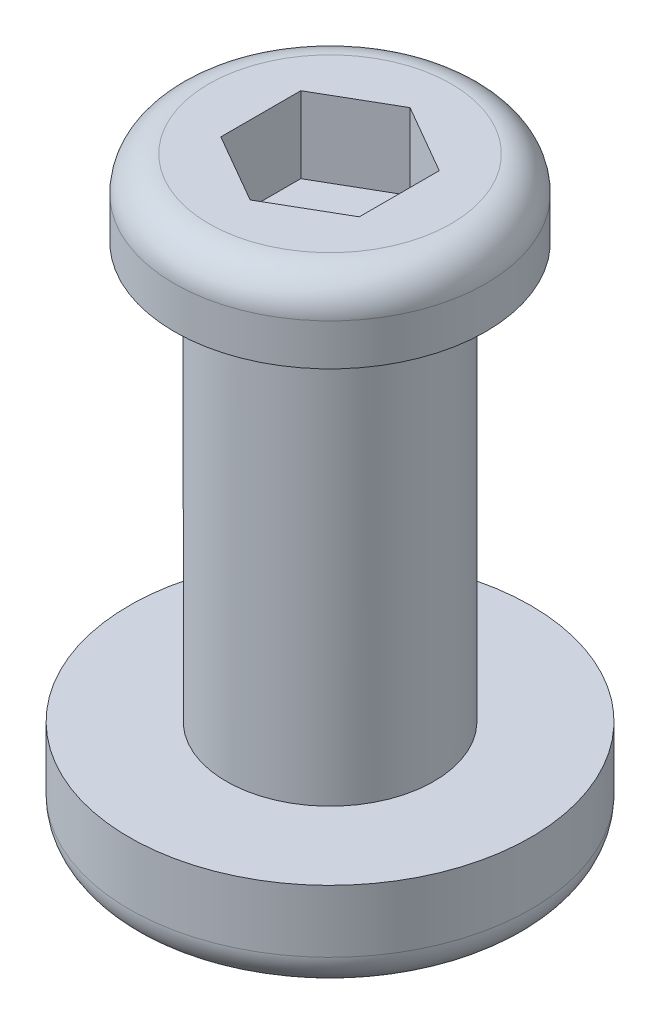
ISO-10303-21;
HEADER;
FILE_DESCRIPTION(('STEP AP214'),'2;1');
FILE_NAME('part.step','',(''),(''),'','','');
FILE_SCHEMA(('AUTOMOTIVE_DESIGN { 1 0 10303 214 1 1 1 1 }'));
ENDSEC;
DATA;
#1=APPLICATION_CONTEXT('core data for automotive mechanical design processes');
#2=APPLICATION_PROTOCOL_DEFINITION('international standard','automotive_design',2000,#1);
#3=PRODUCT_CONTEXT('',#1,'mechanical');
#4=PRODUCT('Part','Part','',(#3));
#5=PRODUCT_RELATED_PRODUCT_CATEGORY('part','',(#4));
#6=PRODUCT_DEFINITION_FORMATION('','',#4);
#7=PRODUCT_DEFINITION_CONTEXT('part definition',#1,'design');
#8=PRODUCT_DEFINITION('design','',#6,#7);
#9=PRODUCT_DEFINITION_SHAPE('','',#8);
#10=(LENGTH_UNIT() NAMED_UNIT(*) SI_UNIT(.MILLI.,.METRE.));
#11=(NAMED_UNIT(*) PLANE_ANGLE_UNIT() SI_UNIT($,.RADIAN.));
#12=(NAMED_UNIT(*) SI_UNIT($,.STERADIAN.) SOLID_ANGLE_UNIT());
#13=UNCERTAINTY_MEASURE_WITH_UNIT(LENGTH_MEASURE(1.E-05),#10,'distance_accuracy_value','');
#14=(GEOMETRIC_REPRESENTATION_CONTEXT(3) GLOBAL_UNCERTAINTY_ASSIGNED_CONTEXT((#13)) GLOBAL_UNIT_ASSIGNED_CONTEXT((#10,
#11,#12)) REPRESENTATION_CONTEXT('',''));
#15=CARTESIAN_POINT('',(0.,0.,0.));
#16=DIRECTION('',(0.,0.,1.));
#17=DIRECTION('',(1.,0.,0.));
#18=AXIS2_PLACEMENT_3D('',#15,#16,#17);
#19=CARTESIAN_POINT('',(0.,6.,0.));
#20=DIRECTION('',(0.,-1.,0.));
#21=DIRECTION('',(0.,0.,-1.));
#22=AXIS2_PLACEMENT_3D('',#19,#20,#21);
#23=CYLINDRICAL_SURFACE('',#22,1.5);
#24=CARTESIAN_POINT('',(0.,6.,0.));
#25=DIRECTION('',(0.,1.,0.));
#26=DIRECTION('',(0.,0.,1.));
#27=AXIS2_PLACEMENT_3D('',#24,#25,#26);
#28=CIRCLE('',#27,1.5);
#29=CARTESIAN_POINT('',(0.,6.,1.5));
#30=VERTEX_POINT('',#29);
#31=EDGE_CURVE('E278',#30,#30,#28,.T.);
#32=ORIENTED_EDGE('',*,*,#31,.F.);
#33=EDGE_LOOP('',(#32));
#34=FACE_BOUND('',#33,.T.);
#35=CARTESIAN_POINT('',(0.,0.,0.));
#36=DIRECTION('',(0.,-1.,0.));
#37=DIRECTION('',(0.,0.,-1.));
#38=AXIS2_PLACEMENT_3D('',#35,#36,#37);
#39=CIRCLE('',#38,1.5);
#40=CARTESIAN_POINT('',(0.,0.,-1.5));
#41=VERTEX_POINT('',#40);
#42=EDGE_CURVE('E210',#41,#41,#39,.T.);
#43=ORIENTED_EDGE('',*,*,#42,.F.);
#44=EDGE_LOOP('',(#43));
#45=FACE_BOUND('',#44,.T.);
#46=ADVANCED_FACE('F43',(#34,#45),#23,.T.);
#47=CARTESIAN_POINT('',(0.,7.1,0.));
#48=DIRECTION('',(0.,1.,0.));
#49=DIRECTION('',(0.,0.,1.));
#50=AXIS2_PLACEMENT_3D('',#47,#48,#49);
#51=PLANE('',#50);
#52=CARTESIAN_POINT('',(0.,7.1,0.));
#53=DIRECTION('',(0.,1.,0.));
#54=DIRECTION('',(0.,0.,1.));
#55=AXIS2_PLACEMENT_3D('',#52,#53,#54);
#56=CIRCLE('',#55,1.75);
#57=CARTESIAN_POINT('',(0.,7.1,1.75));
#58=VERTEX_POINT('',#57);
#59=EDGE_CURVE('E282',#58,#58,#56,.T.);
#60=ORIENTED_EDGE('',*,*,#59,.T.);
#61=EDGE_LOOP('',(#60));
#62=FACE_BOUND('',#61,.T.);
#63=DIRECTION('',(-0.866025403784438,0.,0.5));
#64=VECTOR('',#63,1.);
#65=CARTESIAN_POINT('',(0.,7.1,-1.15470053837925));
#66=LINE('',#65,#64);
#67=CARTESIAN_POINT('',(0.,7.1,-1.15470053837925));
#68=VERTEX_POINT('',#67);
#69=CARTESIAN_POINT('',(-1.,7.1,-0.577350269189626));
#70=VERTEX_POINT('',#69);
#71=EDGE_CURVE('E217',#68,#70,#66,.T.);
#72=ORIENTED_EDGE('',*,*,#71,.F.);
#73=DIRECTION('',(-0.866025403784439,0.,-0.5));
#74=VECTOR('',#73,1.);
#75=CARTESIAN_POINT('',(1.,7.1,-0.577350269189626));
#76=LINE('',#75,#74);
#77=CARTESIAN_POINT('',(1.,7.1,-0.577350269189626));
#78=VERTEX_POINT('',#77);
#79=EDGE_CURVE('E214',#78,#68,#76,.T.);
#80=ORIENTED_EDGE('',*,*,#79,.F.);
#81=DIRECTION('',(0.,0.,-1.));
#82=VECTOR('',#81,1.);
#83=CARTESIAN_POINT('',(1.,7.1,0.577350269189626));
#84=LINE('',#83,#82);
#85=CARTESIAN_POINT('',(1.,7.1,0.577350269189626));
#86=VERTEX_POINT('',#85);
#87=EDGE_CURVE('E231',#86,#78,#84,.T.);
#88=ORIENTED_EDGE('',*,*,#87,.F.);
#89=DIRECTION('',(0.866025403784439,0.,-0.5));
#90=VECTOR('',#89,1.);
#91=CARTESIAN_POINT('',(0.,7.1,1.15470053837925));
#92=LINE('',#91,#90);
#93=CARTESIAN_POINT('',(0.,7.1,1.15470053837925));
#94=VERTEX_POINT('',#93);
#95=EDGE_CURVE('E227',#94,#86,#92,.T.);
#96=ORIENTED_EDGE('',*,*,#95,.F.);
#97=DIRECTION('',(0.866025403784439,0.,0.5));
#98=VECTOR('',#97,1.);
#99=CARTESIAN_POINT('',(-1.,7.1,0.577350269189626));
#100=LINE('',#99,#98);
#101=CARTESIAN_POINT('',(-1.,7.1,0.577350269189626));
#102=VERTEX_POINT('',#101);
#103=EDGE_CURVE('E224',#102,#94,#100,.T.);
#104=ORIENTED_EDGE('',*,*,#103,.F.);
#105=DIRECTION('',(0.,0.,1.));
#106=VECTOR('',#105,1.);
#107=CARTESIAN_POINT('',(-1.,7.1,-0.577350269189626));
#108=LINE('',#107,#106);
#109=EDGE_CURVE('E221',#70,#102,#108,.T.);
#110=ORIENTED_EDGE('',*,*,#109,.F.);
#111=EDGE_LOOP('',(#72,#80,#88,#96,#104,#110));
#112=FACE_BOUND('',#111,.T.);
#113=ADVANCED_FACE('F304',(#62,#112),#51,.T.);
#114=CARTESIAN_POINT('',(0.,6.,0.));
#115=DIRECTION('',(0.,1.,0.));
#116=DIRECTION('',(0.,0.,1.));
#117=AXIS2_PLACEMENT_3D('',#114,#115,#116);
#118=PLANE('',#117);
#119=ORIENTED_EDGE('',*,*,#31,.T.);
#120=EDGE_LOOP('',(#119));
#121=FACE_BOUND('',#120,.T.);
#122=CARTESIAN_POINT('',(0.,6.,0.));
#123=DIRECTION('',(0.,1.,0.));
#124=DIRECTION('',(0.,0.,1.));
#125=AXIS2_PLACEMENT_3D('',#122,#123,#124);
#126=CIRCLE('',#125,2.25);
#127=CARTESIAN_POINT('',(0.,6.,2.25));
#128=VERTEX_POINT('',#127);
#129=EDGE_CURVE('E274',#128,#128,#126,.T.);
#130=ORIENTED_EDGE('',*,*,#129,.F.);
#131=EDGE_LOOP('',(#130));
#132=FACE_BOUND('',#131,.T.);
#133=ADVANCED_FACE('F310',(#121,#132),#118,.F.);
#134=CARTESIAN_POINT('',(0.,7.1,0.));
#135=DIRECTION('',(0.,-1.,0.));
#136=DIRECTION('',(0.,0.,-1.));
#137=AXIS2_PLACEMENT_3D('',#134,#135,#136);
#138=CYLINDRICAL_SURFACE('',#137,2.25);
#139=CARTESIAN_POINT('',(0.,6.6,0.));
#140=DIRECTION('',(0.,1.,0.));
#141=DIRECTION('',(0.,0.,1.));
#142=AXIS2_PLACEMENT_3D('',#139,#140,#141);
#143=CIRCLE('',#142,2.25);
#144=CARTESIAN_POINT('',(0.,6.6,2.25));
#145=VERTEX_POINT('',#144);
#146=EDGE_CURVE('E286',#145,#145,#143,.F.);
#147=ORIENTED_EDGE('',*,*,#146,.T.);
#148=EDGE_LOOP('',(#147));
#149=FACE_BOUND('',#148,.T.);
#150=ORIENTED_EDGE('',*,*,#129,.T.);
#151=EDGE_LOOP('',(#150));
#152=FACE_BOUND('',#151,.T.);
#153=ADVANCED_FACE('F324',(#149,#152),#138,.T.);
#154=CARTESIAN_POINT('',(1.,7.1,-0.577350269189626));
#155=DIRECTION('',(-0.5,0.,0.866025403784438));
#156=DIRECTION('',(0.866025403784439,0.,0.5));
#157=AXIS2_PLACEMENT_3D('',#154,#155,#156);
#158=PLANE('',#157);
#159=DIRECTION('',(-0.866025403784439,0.,-0.5));
#160=VECTOR('',#159,1.);
#161=CARTESIAN_POINT('',(1.,6.,-0.577350269189626));
#162=LINE('',#161,#160);
#163=CARTESIAN_POINT('',(1.,6.,-0.577350269189626));
#164=VERTEX_POINT('',#163);
#165=CARTESIAN_POINT('',(0.,6.,-1.15470053837925));
#166=VERTEX_POINT('',#165);
#167=EDGE_CURVE('E67',#164,#166,#162,.T.);
#168=ORIENTED_EDGE('',*,*,#167,.F.);
#169=DIRECTION('',(0.,-1.,0.));
#170=VECTOR('',#169,1.);
#171=CARTESIAN_POINT('',(1.,7.1,-0.577350269189626));
#172=LINE('',#171,#170);
#173=EDGE_CURVE('E234',#78,#164,#172,.T.);
#174=ORIENTED_EDGE('',*,*,#173,.F.);
#175=ORIENTED_EDGE('',*,*,#79,.T.);
#176=DIRECTION('',(0.,-1.,0.));
#177=VECTOR('',#176,1.);
#178=CARTESIAN_POINT('',(0.,7.1,-1.15470053837925));
#179=LINE('',#178,#177);
#180=EDGE_CURVE('E270',#68,#166,#179,.T.);
#181=ORIENTED_EDGE('',*,*,#180,.T.);
#182=EDGE_LOOP('',(#168,#174,#175,#181));
#183=FACE_BOUND('',#182,.T.);
#184=ADVANCED_FACE('F327',(#183),#158,.T.);
#185=CARTESIAN_POINT('',(0.,7.1,-1.15470053837925));
#186=DIRECTION('',(0.5,0.,0.866025403784439));
#187=DIRECTION('',(0.866025403784438,0.,-0.5));
#188=AXIS2_PLACEMENT_3D('',#185,#186,#187);
#189=PLANE('',#188);
#190=DIRECTION('',(-0.866025403784438,0.,0.5));
#191=VECTOR('',#190,1.);
#192=CARTESIAN_POINT('',(0.,6.,-1.15470053837925));
#193=LINE('',#192,#191);
#194=CARTESIAN_POINT('',(-1.,6.,-0.577350269189626));
#195=VERTEX_POINT('',#194);
#196=EDGE_CURVE('E237',#166,#195,#193,.T.);
#197=ORIENTED_EDGE('',*,*,#196,.F.);
#198=ORIENTED_EDGE('',*,*,#180,.F.);
#199=ORIENTED_EDGE('',*,*,#71,.T.);
#200=DIRECTION('',(0.,-1.,0.));
#201=VECTOR('',#200,1.);
#202=CARTESIAN_POINT('',(-1.,7.1,-0.577350269189626));
#203=LINE('',#202,#201);
#204=EDGE_CURVE('E266',#70,#195,#203,.T.);
#205=ORIENTED_EDGE('',*,*,#204,.T.);
#206=EDGE_LOOP('',(#197,#198,#199,#205));
#207=FACE_BOUND('',#206,.T.);
#208=ADVANCED_FACE('F334',(#207),#189,.T.);
#209=CARTESIAN_POINT('',(-1.,7.1,-0.577350269189626));
#210=DIRECTION('',(1.,0.,0.));
#211=DIRECTION('',(0.,0.,-1.));
#212=AXIS2_PLACEMENT_3D('',#209,#210,#211);
#213=PLANE('',#212);
#214=DIRECTION('',(0.,0.,1.));
#215=VECTOR('',#214,1.);
#216=CARTESIAN_POINT('',(-1.,6.,-0.577350269189626));
#217=LINE('',#216,#215);
#218=CARTESIAN_POINT('',(-1.,6.,0.577350269189626));
#219=VERTEX_POINT('',#218);
#220=EDGE_CURVE('E240',#195,#219,#217,.T.);
#221=ORIENTED_EDGE('',*,*,#220,.F.);
#222=ORIENTED_EDGE('',*,*,#204,.F.);
#223=ORIENTED_EDGE('',*,*,#109,.T.);
#224=DIRECTION('',(0.,-1.,0.));
#225=VECTOR('',#224,1.);
#226=CARTESIAN_POINT('',(-1.,7.1,0.577350269189626));
#227=LINE('',#226,#225);
#228=EDGE_CURVE('E262',#102,#219,#227,.T.);
#229=ORIENTED_EDGE('',*,*,#228,.T.);
#230=EDGE_LOOP('',(#221,#222,#223,#229));
#231=FACE_BOUND('',#230,.T.);
#232=ADVANCED_FACE('F338',(#231),#213,.T.);
#233=CARTESIAN_POINT('',(-1.,7.1,0.577350269189626));
#234=DIRECTION('',(0.5,0.,-0.866025403784438));
#235=DIRECTION('',(-0.866025403784439,0.,-0.5));
#236=AXIS2_PLACEMENT_3D('',#233,#234,#235);
#237=PLANE('',#236);
#238=DIRECTION('',(0.866025403784439,0.,0.5));
#239=VECTOR('',#238,1.);
#240=CARTESIAN_POINT('',(-1.,6.,0.577350269189626));
#241=LINE('',#240,#239);
#242=CARTESIAN_POINT('',(0.,6.,1.15470053837925));
#243=VERTEX_POINT('',#242);
#244=EDGE_CURVE('E243',#219,#243,#241,.T.);
#245=ORIENTED_EDGE('',*,*,#244,.F.);
#246=ORIENTED_EDGE('',*,*,#228,.F.);
#247=ORIENTED_EDGE('',*,*,#103,.T.);
#248=DIRECTION('',(0.,-1.,0.));
#249=VECTOR('',#248,1.);
#250=CARTESIAN_POINT('',(0.,7.1,1.15470053837925));
#251=LINE('',#250,#249);
#252=EDGE_CURVE('E258',#94,#243,#251,.T.);
#253=ORIENTED_EDGE('',*,*,#252,.T.);
#254=EDGE_LOOP('',(#245,#246,#247,#253));
#255=FACE_BOUND('',#254,.T.);
#256=ADVANCED_FACE('F342',(#255),#237,.T.);
#257=CARTESIAN_POINT('',(0.,7.1,1.15470053837925));
#258=DIRECTION('',(-0.5,0.,-0.866025403784439));
#259=DIRECTION('',(-0.866025403784439,0.,0.5));
#260=AXIS2_PLACEMENT_3D('',#257,#258,#259);
#261=PLANE('',#260);
#262=DIRECTION('',(0.866025403784439,0.,-0.5));
#263=VECTOR('',#262,1.);
#264=CARTESIAN_POINT('',(0.,6.,1.15470053837925));
#265=LINE('',#264,#263);
#266=CARTESIAN_POINT('',(1.,6.,0.577350269189626));
#267=VERTEX_POINT('',#266);
#268=EDGE_CURVE('E246',#243,#267,#265,.T.);
#269=ORIENTED_EDGE('',*,*,#268,.F.);
#270=ORIENTED_EDGE('',*,*,#252,.F.);
#271=ORIENTED_EDGE('',*,*,#95,.T.);
#272=DIRECTION('',(0.,-1.,0.));
#273=VECTOR('',#272,1.);
#274=CARTESIAN_POINT('',(1.,7.1,0.577350269189626));
#275=LINE('',#274,#273);
#276=EDGE_CURVE('E254',#86,#267,#275,.T.);
#277=ORIENTED_EDGE('',*,*,#276,.T.);
#278=EDGE_LOOP('',(#269,#270,#271,#277));
#279=FACE_BOUND('',#278,.T.);
#280=ADVANCED_FACE('F346',(#279),#261,.T.);
#281=CARTESIAN_POINT('',(1.,7.1,0.577350269189626));
#282=DIRECTION('',(-1.,0.,0.));
#283=DIRECTION('',(0.,0.,1.));
#284=AXIS2_PLACEMENT_3D('',#281,#282,#283);
#285=PLANE('',#284);
#286=DIRECTION('',(0.,0.,-1.));
#287=VECTOR('',#286,1.);
#288=CARTESIAN_POINT('',(1.,6.,0.577350269189626));
#289=LINE('',#288,#287);
#290=EDGE_CURVE('E218',#267,#164,#289,.T.);
#291=ORIENTED_EDGE('',*,*,#290,.F.);
#292=ORIENTED_EDGE('',*,*,#276,.F.);
#293=ORIENTED_EDGE('',*,*,#87,.T.);
#294=ORIENTED_EDGE('',*,*,#173,.T.);
#295=EDGE_LOOP('',(#291,#292,#293,#294));
#296=FACE_BOUND('',#295,.T.);
#297=ADVANCED_FACE('F323',(#296),#285,.T.);
#298=CARTESIAN_POINT('',(0.,6.,0.));
#299=DIRECTION('',(0.,1.,0.));
#300=DIRECTION('',(0.,0.,1.));
#301=AXIS2_PLACEMENT_3D('',#298,#299,#300);
#302=PLANE('',#301);
#303=ORIENTED_EDGE('',*,*,#167,.T.);
#304=ORIENTED_EDGE('',*,*,#196,.T.);
#305=ORIENTED_EDGE('',*,*,#220,.T.);
#306=ORIENTED_EDGE('',*,*,#244,.T.);
#307=ORIENTED_EDGE('',*,*,#268,.T.);
#308=ORIENTED_EDGE('',*,*,#290,.T.);
#309=EDGE_LOOP('',(#303,#304,#305,#306,#307,#308));
#310=FACE_BOUND('',#309,.T.);
#311=ADVANCED_FACE('F320',(#310),#302,.T.);
#312=CARTESIAN_POINT('',(0.,-1.4,0.));
#313=DIRECTION('',(0.,-1.,0.));
#314=DIRECTION('',(0.,0.,-1.));
#315=AXIS2_PLACEMENT_3D('',#312,#313,#314);
#316=PLANE('',#315);
#317=CARTESIAN_POINT('',(0.,-1.4,0.));
#318=DIRECTION('',(0.,-1.,0.));
#319=DIRECTION('',(0.,0.,-1.));
#320=AXIS2_PLACEMENT_3D('',#317,#318,#319);
#321=CIRCLE('',#320,2.4);
#322=CARTESIAN_POINT('',(0.,-1.4,-2.4));
#323=VERTEX_POINT('',#322);
#324=EDGE_CURVE('E52',#323,#323,#321,.T.);
#325=ORIENTED_EDGE('',*,*,#324,.T.);
#326=EDGE_LOOP('',(#325));
#327=FACE_BOUND('',#326,.T.);
#328=DIRECTION('',(-0.866025403784439,0.,-0.5));
#329=VECTOR('',#328,1.);
#330=CARTESIAN_POINT('',(0.,-1.4,1.15470053837925));
#331=LINE('',#330,#329);
#332=CARTESIAN_POINT('',(0.,-1.4,1.15470053837925));
#333=VERTEX_POINT('',#332);
#334=CARTESIAN_POINT('',(-1.,-1.4,0.577350269189626));
#335=VERTEX_POINT('',#334);
#336=EDGE_CURVE('E143',#333,#335,#331,.T.);
#337=ORIENTED_EDGE('',*,*,#336,.F.);
#338=DIRECTION('',(-0.866025403784439,0.,0.5));
#339=VECTOR('',#338,1.);
#340=CARTESIAN_POINT('',(1.,-1.4,0.577350269189627));
#341=LINE('',#340,#339);
#342=CARTESIAN_POINT('',(1.,-1.4,0.577350269189627));
#343=VERTEX_POINT('',#342);
#344=EDGE_CURVE('E134',#343,#333,#341,.T.);
#345=ORIENTED_EDGE('',*,*,#344,.F.);
#346=DIRECTION('',(0.,0.,1.));
#347=VECTOR('',#346,1.);
#348=CARTESIAN_POINT('',(1.,-1.4,-0.577350269189626));
#349=LINE('',#348,#347);
#350=CARTESIAN_POINT('',(1.,-1.4,-0.577350269189626));
#351=VERTEX_POINT('',#350);
#352=EDGE_CURVE('E171',#351,#343,#349,.T.);
#353=ORIENTED_EDGE('',*,*,#352,.F.);
#354=DIRECTION('',(0.866025403784439,0.,0.5));
#355=VECTOR('',#354,1.);
#356=CARTESIAN_POINT('',(0.,-1.4,-1.15470053837925));
#357=LINE('',#356,#355);
#358=CARTESIAN_POINT('',(0.,-1.4,-1.15470053837925));
#359=VERTEX_POINT('',#358);
#360=EDGE_CURVE('E167',#359,#351,#357,.T.);
#361=ORIENTED_EDGE('',*,*,#360,.F.);
#362=DIRECTION('',(0.866025403784439,0.,-0.5));
#363=VECTOR('',#362,1.);
#364=CARTESIAN_POINT('',(-1.,-1.4,-0.577350269189626));
#365=LINE('',#364,#363);
#366=CARTESIAN_POINT('',(-1.,-1.4,-0.577350269189626));
#367=VERTEX_POINT('',#366);
#368=EDGE_CURVE('E162',#367,#359,#365,.T.);
#369=ORIENTED_EDGE('',*,*,#368,.F.);
#370=DIRECTION('',(0.,0.,-1.));
#371=VECTOR('',#370,1.);
#372=CARTESIAN_POINT('',(-1.,-1.4,0.577350269189626));
#373=LINE('',#372,#371);
#374=EDGE_CURVE('E158',#335,#367,#373,.T.);
#375=ORIENTED_EDGE('',*,*,#374,.F.);
#376=EDGE_LOOP('',(#337,#345,#353,#361,#369,#375));
#377=FACE_BOUND('',#376,.T.);
#378=ADVANCED_FACE('F156',(#327,#377),#316,.T.);
#379=CARTESIAN_POINT('',(0.,0.,0.));
#380=DIRECTION('',(0.,-1.,0.));
#381=DIRECTION('',(0.,0.,-1.));
#382=AXIS2_PLACEMENT_3D('',#379,#380,#381);
#383=PLANE('',#382);
#384=ORIENTED_EDGE('',*,*,#42,.T.);
#385=EDGE_LOOP('',(#384));
#386=FACE_BOUND('',#385,.T.);
#387=CARTESIAN_POINT('',(0.,0.,0.));
#388=DIRECTION('',(0.,-1.,0.));
#389=DIRECTION('',(0.,0.,-1.));
#390=AXIS2_PLACEMENT_3D('',#387,#388,#389);
#391=CIRCLE('',#390,2.9);
#392=CARTESIAN_POINT('',(0.,0.,-2.9));
#393=VERTEX_POINT('',#392);
#394=EDGE_CURVE('E152',#393,#393,#391,.T.);
#395=ORIENTED_EDGE('',*,*,#394,.F.);
#396=EDGE_LOOP('',(#395));
#397=FACE_BOUND('',#396,.T.);
#398=ADVANCED_FACE('F357',(#386,#397),#383,.F.);
#399=CARTESIAN_POINT('',(0.,-1.4,0.));
#400=DIRECTION('',(0.,1.,0.));
#401=DIRECTION('',(0.,0.,1.));
#402=AXIS2_PLACEMENT_3D('',#399,#400,#401);
#403=CYLINDRICAL_SURFACE('',#402,2.9);
#404=CARTESIAN_POINT('',(0.,-0.9,0.));
#405=DIRECTION('',(0.,-1.,0.));
#406=DIRECTION('',(0.,0.,-1.));
#407=AXIS2_PLACEMENT_3D('',#404,#405,#406);
#408=CIRCLE('',#407,2.9);
#409=CARTESIAN_POINT('',(0.,-0.9,-2.9));
#410=VERTEX_POINT('',#409);
#411=EDGE_CURVE('E11',#410,#410,#408,.F.);
#412=ORIENTED_EDGE('',*,*,#411,.T.);
#413=EDGE_LOOP('',(#412));
#414=FACE_BOUND('',#413,.T.);
#415=ORIENTED_EDGE('',*,*,#394,.T.);
#416=EDGE_LOOP('',(#415));
#417=FACE_BOUND('',#416,.T.);
#418=ADVANCED_FACE('F354',(#414,#417),#403,.T.);
#419=CARTESIAN_POINT('',(1.,-1.4,0.577350269189627));
#420=DIRECTION('',(-0.5,0.,-0.866025403784439));
#421=DIRECTION('',(-0.866025403784439,0.,0.5));
#422=AXIS2_PLACEMENT_3D('',#419,#420,#421);
#423=PLANE('',#422);
#424=DIRECTION('',(-0.866025403784439,0.,0.5));
#425=VECTOR('',#424,1.);
#426=CARTESIAN_POINT('',(1.,0.,0.577350269189627));
#427=LINE('',#426,#425);
#428=CARTESIAN_POINT('',(1.,0.,0.577350269189627));
#429=VERTEX_POINT('',#428);
#430=CARTESIAN_POINT('',(0.,0.,1.15470053837925));
#431=VERTEX_POINT('',#430);
#432=EDGE_CURVE('E174',#429,#431,#427,.T.);
#433=ORIENTED_EDGE('',*,*,#432,.F.);
#434=DIRECTION('',(0.,1.,0.));
#435=VECTOR('',#434,1.);
#436=CARTESIAN_POINT('',(1.,-1.4,0.577350269189627));
#437=LINE('',#436,#435);
#438=EDGE_CURVE('E59',#343,#429,#437,.T.);
#439=ORIENTED_EDGE('',*,*,#438,.F.);
#440=ORIENTED_EDGE('',*,*,#344,.T.);
#441=DIRECTION('',(0.,1.,0.));
#442=VECTOR('',#441,1.);
#443=CARTESIAN_POINT('',(0.,-1.4,1.15470053837925));
#444=LINE('',#443,#442);
#445=EDGE_CURVE('E137',#333,#431,#444,.T.);
#446=ORIENTED_EDGE('',*,*,#445,.T.);
#447=EDGE_LOOP('',(#433,#439,#440,#446));
#448=FACE_BOUND('',#447,.T.);
#449=ADVANCED_FACE('F136',(#448),#423,.T.);
#450=CARTESIAN_POINT('',(0.,-1.4,1.15470053837925));
#451=DIRECTION('',(0.5,0.,-0.866025403784439));
#452=DIRECTION('',(-0.866025403784439,0.,-0.5));
#453=AXIS2_PLACEMENT_3D('',#450,#451,#452);
#454=PLANE('',#453);
#455=DIRECTION('',(-0.866025403784439,0.,-0.5));
#456=VECTOR('',#455,1.);
#457=CARTESIAN_POINT('',(0.,0.,1.15470053837925));
#458=LINE('',#457,#456);
#459=CARTESIAN_POINT('',(-1.,0.,0.577350269189626));
#460=VERTEX_POINT('',#459);
#461=EDGE_CURVE('E150',#431,#460,#458,.T.);
#462=ORIENTED_EDGE('',*,*,#461,.F.);
#463=ORIENTED_EDGE('',*,*,#445,.F.);
#464=ORIENTED_EDGE('',*,*,#336,.T.);
#465=DIRECTION('',(0.,1.,0.));
#466=VECTOR('',#465,1.);
#467=CARTESIAN_POINT('',(-1.,-1.4,0.577350269189626));
#468=LINE('',#467,#466);
#469=EDGE_CURVE('E153',#335,#460,#468,.T.);
#470=ORIENTED_EDGE('',*,*,#469,.T.);
#471=EDGE_LOOP('',(#462,#463,#464,#470));
#472=FACE_BOUND('',#471,.T.);
#473=ADVANCED_FACE('F147',(#472),#454,.T.);
#474=CARTESIAN_POINT('',(-1.,-1.4,0.577350269189626));
#475=DIRECTION('',(1.,0.,0.));
#476=DIRECTION('',(0.,0.,-1.));
#477=AXIS2_PLACEMENT_3D('',#474,#475,#476);
#478=PLANE('',#477);
#479=DIRECTION('',(0.,0.,-1.));
#480=VECTOR('',#479,1.);
#481=CARTESIAN_POINT('',(-1.,0.,0.577350269189626));
#482=LINE('',#481,#480);
#483=CARTESIAN_POINT('',(-1.,0.,-0.577350269189626));
#484=VERTEX_POINT('',#483);
#485=EDGE_CURVE('E179',#460,#484,#482,.T.);
#486=ORIENTED_EDGE('',*,*,#485,.F.);
#487=ORIENTED_EDGE('',*,*,#469,.F.);
#488=ORIENTED_EDGE('',*,*,#374,.T.);
#489=DIRECTION('',(0.,1.,0.));
#490=VECTOR('',#489,1.);
#491=CARTESIAN_POINT('',(-1.,-1.4,-0.577350269189626));
#492=LINE('',#491,#490);
#493=EDGE_CURVE('E202',#367,#484,#492,.T.);
#494=ORIENTED_EDGE('',*,*,#493,.T.);
#495=EDGE_LOOP('',(#486,#487,#488,#494));
#496=FACE_BOUND('',#495,.T.);
#497=ADVANCED_FACE('F368',(#496),#478,.T.);
#498=CARTESIAN_POINT('',(-1.,-1.4,-0.577350269189626));
#499=DIRECTION('',(0.5,0.,0.866025403784439));
#500=DIRECTION('',(0.866025403784439,0.,-0.5));
#501=AXIS2_PLACEMENT_3D('',#498,#499,#500);
#502=PLANE('',#501);
#503=DIRECTION('',(0.866025403784439,0.,-0.5));
#504=VECTOR('',#503,1.);
#505=CARTESIAN_POINT('',(-1.,0.,-0.577350269189626));
#506=LINE('',#505,#504);
#507=CARTESIAN_POINT('',(0.,0.,-1.15470053837925));
#508=VERTEX_POINT('',#507);
#509=EDGE_CURVE('E183',#484,#508,#506,.T.);
#510=ORIENTED_EDGE('',*,*,#509,.F.);
#511=ORIENTED_EDGE('',*,*,#493,.F.);
#512=ORIENTED_EDGE('',*,*,#368,.T.);
#513=DIRECTION('',(0.,1.,0.));
#514=VECTOR('',#513,1.);
#515=CARTESIAN_POINT('',(0.,-1.4,-1.15470053837925));
#516=LINE('',#515,#514);
#517=EDGE_CURVE('E199',#359,#508,#516,.T.);
#518=ORIENTED_EDGE('',*,*,#517,.T.);
#519=EDGE_LOOP('',(#510,#511,#512,#518));
#520=FACE_BOUND('',#519,.T.);
#521=ADVANCED_FACE('F371',(#520),#502,.T.);
#522=CARTESIAN_POINT('',(0.,-1.4,-1.15470053837925));
#523=DIRECTION('',(-0.5,0.,0.866025403784439));
#524=DIRECTION('',(0.866025403784439,0.,0.5));
#525=AXIS2_PLACEMENT_3D('',#522,#523,#524);
#526=PLANE('',#525);
#527=DIRECTION('',(0.866025403784439,0.,0.5));
#528=VECTOR('',#527,1.);
#529=CARTESIAN_POINT('',(0.,0.,-1.15470053837925));
#530=LINE('',#529,#528);
#531=CARTESIAN_POINT('',(1.,0.,-0.577350269189626));
#532=VERTEX_POINT('',#531);
#533=EDGE_CURVE('E187',#508,#532,#530,.T.);
#534=ORIENTED_EDGE('',*,*,#533,.F.);
#535=ORIENTED_EDGE('',*,*,#517,.F.);
#536=ORIENTED_EDGE('',*,*,#360,.T.);
#537=DIRECTION('',(0.,1.,0.));
#538=VECTOR('',#537,1.);
#539=CARTESIAN_POINT('',(1.,-1.4,-0.577350269189626));
#540=LINE('',#539,#538);
#541=EDGE_CURVE('E196',#351,#532,#540,.T.);
#542=ORIENTED_EDGE('',*,*,#541,.T.);
#543=EDGE_LOOP('',(#534,#535,#536,#542));
#544=FACE_BOUND('',#543,.T.);
#545=ADVANCED_FACE('F375',(#544),#526,.T.);
#546=CARTESIAN_POINT('',(1.,-1.4,-0.577350269189626));
#547=DIRECTION('',(-1.,0.,0.));
#548=DIRECTION('',(0.,0.,1.));
#549=AXIS2_PLACEMENT_3D('',#546,#547,#548);
#550=PLANE('',#549);
#551=DIRECTION('',(0.,0.,1.));
#552=VECTOR('',#551,1.);
#553=CARTESIAN_POINT('',(1.,0.,-0.577350269189626));
#554=LINE('',#553,#552);
#555=EDGE_CURVE('E144',#532,#429,#554,.T.);
#556=ORIENTED_EDGE('',*,*,#555,.F.);
#557=ORIENTED_EDGE('',*,*,#541,.F.);
#558=ORIENTED_EDGE('',*,*,#352,.T.);
#559=ORIENTED_EDGE('',*,*,#438,.T.);
#560=EDGE_LOOP('',(#556,#557,#558,#559));
#561=FACE_BOUND('',#560,.T.);
#562=ADVANCED_FACE('F318',(#561),#550,.T.);
#563=CARTESIAN_POINT('',(0.,0.,0.));
#564=DIRECTION('',(0.,1.,0.));
#565=DIRECTION('',(0.,0.,1.));
#566=AXIS2_PLACEMENT_3D('',#563,#564,#565);
#567=PLANE('',#566);
#568=ORIENTED_EDGE('',*,*,#555,.T.);
#569=ORIENTED_EDGE('',*,*,#432,.T.);
#570=ORIENTED_EDGE('',*,*,#461,.T.);
#571=ORIENTED_EDGE('',*,*,#485,.T.);
#572=ORIENTED_EDGE('',*,*,#509,.T.);
#573=ORIENTED_EDGE('',*,*,#533,.T.);
#574=EDGE_LOOP('',(#568,#569,#570,#571,#572,#573));
#575=FACE_BOUND('',#574,.T.);
#576=ADVANCED_FACE('F300',(#575),#567,.F.);
#577=CARTESIAN_POINT('',(0.,6.6,0.));
#578=DIRECTION('',(0.,1.,0.));
#579=DIRECTION('',(0.,0.,1.));
#580=AXIS2_PLACEMENT_3D('',#577,#578,#579);
#581=TOROIDAL_SURFACE('',#580,1.75,0.5);
#582=ORIENTED_EDGE('',*,*,#146,.F.);
#583=EDGE_LOOP('',(#582));
#584=FACE_BOUND('',#583,.T.);
#585=ORIENTED_EDGE('',*,*,#59,.F.);
#586=EDGE_LOOP('',(#585));
#587=FACE_BOUND('',#586,.T.);
#588=ADVANCED_FACE('F295',(#584,#587),#581,.T.);
#589=CARTESIAN_POINT('',(0.,-0.9,0.));
#590=DIRECTION('',(0.,-1.,0.));
#591=DIRECTION('',(0.,0.,-1.));
#592=AXIS2_PLACEMENT_3D('',#589,#590,#591);
#593=TOROIDAL_SURFACE('',#592,2.4,0.5);
#594=ORIENTED_EDGE('',*,*,#411,.F.);
#595=EDGE_LOOP('',(#594));
#596=FACE_BOUND('',#595,.T.);
#597=ORIENTED_EDGE('',*,*,#324,.F.);
#598=EDGE_LOOP('',(#597));
#599=FACE_BOUND('',#598,.T.);
#600=ADVANCED_FACE('F45',(#596,#599),#593,.T.);
#601=CLOSED_SHELL('',(#46,#113,#133,#153,#184,#208,#232,#256,#280,#297,#311,#378,#398,#418,#449,
#473,#497,#521,#545,#562,#576,#588,#600));
#602=MANIFOLD_SOLID_BREP('B2',#601);
#603=ADVANCED_BREP_SHAPE_REPRESENTATION('',(#18,#602),#14);
#604=SHAPE_DEFINITION_REPRESENTATION(#9,#603);
ENDSEC;
END-ISO-10303-21;
